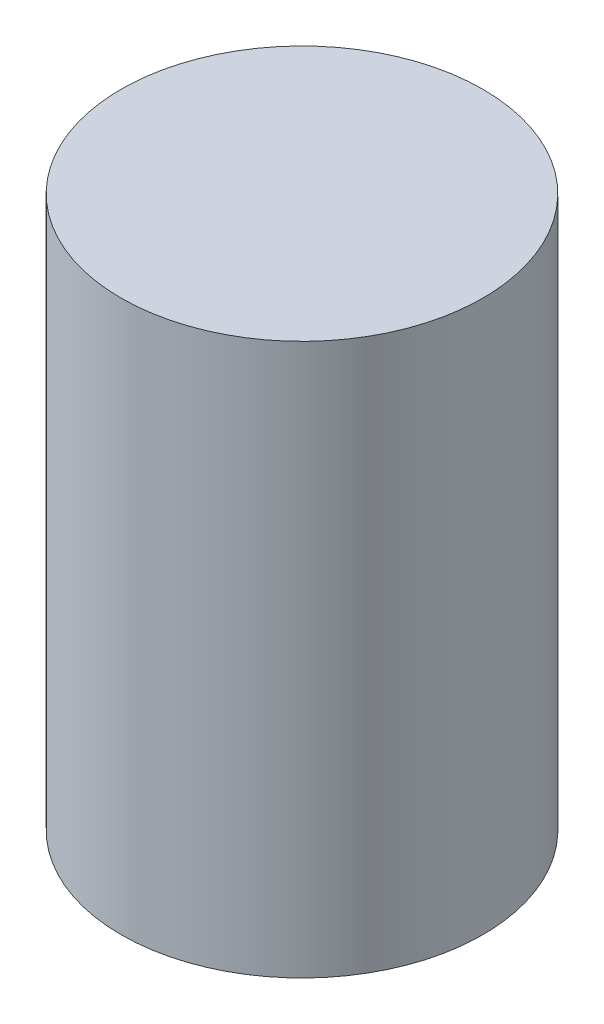
ISO-10303-21;
HEADER;
FILE_DESCRIPTION(('STEP AP214'),'2;1');
FILE_NAME('part.step','',(''),(''),'','','');
FILE_SCHEMA(('AUTOMOTIVE_DESIGN { 1 0 10303 214 1 1 1 1 }'));
ENDSEC;
DATA;
#1=APPLICATION_CONTEXT('core data for automotive mechanical design processes');
#2=APPLICATION_PROTOCOL_DEFINITION('international standard','automotive_design',2000,#1);
#3=PRODUCT_CONTEXT('',#1,'mechanical');
#4=PRODUCT('Part','Part','',(#3));
#5=PRODUCT_RELATED_PRODUCT_CATEGORY('part','',(#4));
#6=PRODUCT_DEFINITION_FORMATION('','',#4);
#7=PRODUCT_DEFINITION_CONTEXT('part definition',#1,'design');
#8=PRODUCT_DEFINITION('design','',#6,#7);
#9=PRODUCT_DEFINITION_SHAPE('','',#8);
#10=(LENGTH_UNIT() NAMED_UNIT(*) SI_UNIT(.MILLI.,.METRE.));
#11=(NAMED_UNIT(*) PLANE_ANGLE_UNIT() SI_UNIT($,.RADIAN.));
#12=(NAMED_UNIT(*) SI_UNIT($,.STERADIAN.) SOLID_ANGLE_UNIT());
#13=UNCERTAINTY_MEASURE_WITH_UNIT(LENGTH_MEASURE(1.E-05),#10,'distance_accuracy_value','');
#14=(GEOMETRIC_REPRESENTATION_CONTEXT(3) GLOBAL_UNCERTAINTY_ASSIGNED_CONTEXT((#13)) GLOBAL_UNIT_ASSIGNED_CONTEXT((#10,
#11,#12)) REPRESENTATION_CONTEXT('',''));
#15=CARTESIAN_POINT('',(0.,0.,0.));
#16=DIRECTION('',(0.,0.,1.));
#17=DIRECTION('',(1.,0.,0.));
#18=AXIS2_PLACEMENT_3D('',#15,#16,#17);
#19=CARTESIAN_POINT('',(0.,152.4,0.));
#20=DIRECTION('',(0.,-1.,0.));
#21=DIRECTION('',(0.,0.,-1.));
#22=AXIS2_PLACEMENT_3D('',#19,#20,#21);
#23=CYLINDRICAL_SURFACE('',#22,50.);
#24=CARTESIAN_POINT('',(0.,152.4,0.));
#25=DIRECTION('',(0.,1.,0.));
#26=DIRECTION('',(0.,0.,1.));
#27=AXIS2_PLACEMENT_3D('',#24,#25,#26);
#28=CIRCLE('',#27,50.);
#29=CARTESIAN_POINT('',(0.,152.4,-50.));
#30=VERTEX_POINT('',#29);
#31=EDGE_CURVE('E10',#30,#30,#28,.T.);
#32=CARTESIAN_POINT('',(0.,0.,0.));
#33=DIRECTION('',(0.,1.,0.));
#34=DIRECTION('',(0.,0.,1.));
#35=AXIS2_PLACEMENT_3D('',#32,#33,#34);
#36=CIRCLE('',#35,50.);
#37=CARTESIAN_POINT('',(0.,0.,-50.));
#38=VERTEX_POINT('',#37);
#39=EDGE_CURVE('E34',#38,#38,#36,.T.);
#40=CARTESIAN_POINT('',(0.,152.4,-50.));
#41=CARTESIAN_POINT('',(0.,150.8125,-50.));
#42=CARTESIAN_POINT('',(0.,149.225,-50.));
#43=CARTESIAN_POINT('',(0.,146.05,-50.));
#44=CARTESIAN_POINT('',(0.,144.4625,-50.));
#45=CARTESIAN_POINT('',(0.,141.2875,-50.));
#46=CARTESIAN_POINT('',(0.,139.7,-50.));
#47=CARTESIAN_POINT('',(0.,136.525,-50.));
#48=CARTESIAN_POINT('',(0.,134.9375,-50.));
#49=CARTESIAN_POINT('',(0.,131.7625,-50.));
#50=CARTESIAN_POINT('',(0.,130.175,-50.));
#51=CARTESIAN_POINT('',(0.,127.,-50.));
#52=CARTESIAN_POINT('',(0.,125.4125,-50.));
#53=CARTESIAN_POINT('',(0.,122.2375,-50.));
#54=CARTESIAN_POINT('',(0.,120.65,-50.));
#55=CARTESIAN_POINT('',(0.,117.475,-50.));
#56=CARTESIAN_POINT('',(0.,115.8875,-50.));
#57=CARTESIAN_POINT('',(0.,112.7125,-50.));
#58=CARTESIAN_POINT('',(0.,111.125,-50.));
#59=CARTESIAN_POINT('',(0.,107.95,-50.));
#60=CARTESIAN_POINT('',(0.,106.3625,-50.));
#61=CARTESIAN_POINT('',(0.,103.1875,-50.));
#62=CARTESIAN_POINT('',(0.,101.6,-50.));
#63=CARTESIAN_POINT('',(0.,98.425,-50.));
#64=CARTESIAN_POINT('',(0.,96.8375,-50.));
#65=CARTESIAN_POINT('',(0.,93.6625,-50.));
#66=CARTESIAN_POINT('',(0.,92.075,-50.));
#67=CARTESIAN_POINT('',(0.,88.9,-50.));
#68=CARTESIAN_POINT('',(0.,87.3125,-50.));
#69=CARTESIAN_POINT('',(0.,84.1375,-50.));
#70=CARTESIAN_POINT('',(0.,82.55,-50.));
#71=CARTESIAN_POINT('',(0.,79.375,-50.));
#72=CARTESIAN_POINT('',(0.,77.7875,-50.));
#73=CARTESIAN_POINT('',(0.,74.6125,-50.));
#74=CARTESIAN_POINT('',(0.,73.025,-50.));
#75=CARTESIAN_POINT('',(0.,69.85,-50.));
#76=CARTESIAN_POINT('',(0.,68.2625,-50.));
#77=CARTESIAN_POINT('',(0.,65.0875,-50.));
#78=CARTESIAN_POINT('',(0.,63.5,-50.));
#79=CARTESIAN_POINT('',(0.,60.325,-50.));
#80=CARTESIAN_POINT('',(0.,58.7375,-50.));
#81=CARTESIAN_POINT('',(0.,55.5625,-50.));
#82=CARTESIAN_POINT('',(0.,53.975,-50.));
#83=CARTESIAN_POINT('',(0.,50.8,-50.));
#84=CARTESIAN_POINT('',(0.,49.2125,-50.));
#85=CARTESIAN_POINT('',(0.,46.0375,-50.));
#86=CARTESIAN_POINT('',(0.,44.45,-50.));
#87=CARTESIAN_POINT('',(0.,41.275,-50.));
#88=CARTESIAN_POINT('',(0.,39.6875,-50.));
#89=CARTESIAN_POINT('',(0.,36.5125,-50.));
#90=CARTESIAN_POINT('',(0.,34.925,-50.));
#91=CARTESIAN_POINT('',(0.,31.75,-50.));
#92=CARTESIAN_POINT('',(0.,30.1625,-50.));
#93=CARTESIAN_POINT('',(0.,26.9875,-50.));
#94=CARTESIAN_POINT('',(0.,25.4,-50.));
#95=CARTESIAN_POINT('',(0.,22.225,-50.));
#96=CARTESIAN_POINT('',(0.,20.6375,-50.));
#97=CARTESIAN_POINT('',(0.,17.4625,-50.));
#98=CARTESIAN_POINT('',(0.,15.875,-50.));
#99=CARTESIAN_POINT('',(0.,12.7,-50.));
#100=CARTESIAN_POINT('',(0.,11.1125,-50.));
#101=CARTESIAN_POINT('',(0.,7.93750000000001,-50.));
#102=CARTESIAN_POINT('',(0.,6.35,-50.));
#103=CARTESIAN_POINT('',(0.,3.175,-50.));
#104=CARTESIAN_POINT('',(0.,1.5875,-50.));
#105=CARTESIAN_POINT('',(0.,0.,-50.));
#106=B_SPLINE_CURVE_WITH_KNOTS('',3,(#40,#41,#42,#43,#44,#45,#46,#47,#48,#49,#50,#51,#52,#53,
#54,#55,#56,#57,#58,#59,#60,#61,#62,#63,#64,#65,#66,#67,#68,#69,#70,#71,#72,#73,#74,#75,#76,#77,
#78,#79,#80,#81,#82,#83,#84,#85,#86,#87,#88,#89,#90,#91,#92,#93,#94,#95,#96,#97,#98,#99,#100,
#101,#102,#103,#104,#105),.UNSPECIFIED.,.F.,.F.,(4,2,2,2,2,2,2,2,2,2,2,2,2,2,2,2,2,2,2,2,2,2,2,
2,2,2,2,2,2,2,2,2,4),(0.,4.7625,9.52500000000001,14.2875,19.05,23.8125,28.575,33.3375,38.1,
42.8625,47.625,52.3875,57.15,61.9125,66.675,71.4375,76.2,80.9625,85.725,90.4875,95.25,100.0125,
104.775,109.5375,114.3,119.0625,123.825,128.5875,133.35,138.1125,142.875,147.6375,152.4),.UNSPECIFIED.);
#107=EDGE_CURVE('BSEAM31',#30,#38,#106,.T.);
#108=ORIENTED_EDGE('',*,*,#31,.F.);
#109=ORIENTED_EDGE('',*,*,#39,.T.);
#110=ORIENTED_EDGE('',*,*,#107,.T.);
#111=ORIENTED_EDGE('',*,*,#107,.F.);
#112=EDGE_LOOP('',(#108,#110,#109,#111));
#113=FACE_BOUND('',#112,.T.);
#114=ADVANCED_FACE('F31',(#113),#23,.T.);
#115=CARTESIAN_POINT('',(0.,152.4,0.));
#116=DIRECTION('',(0.,1.,0.));
#117=DIRECTION('',(0.,0.,1.));
#118=AXIS2_PLACEMENT_3D('',#115,#116,#117);
#119=PLANE('',#118);
#120=ORIENTED_EDGE('',*,*,#31,.T.);
#121=EDGE_LOOP('',(#120));
#122=FACE_BOUND('',#121,.T.);
#123=ADVANCED_FACE('F46',(#122),#119,.T.);
#124=CARTESIAN_POINT('',(0.,0.,0.));
#125=DIRECTION('',(0.,1.,0.));
#126=DIRECTION('',(0.,0.,1.));
#127=AXIS2_PLACEMENT_3D('',#124,#125,#126);
#128=PLANE('',#127);
#129=ORIENTED_EDGE('',*,*,#39,.F.);
#130=EDGE_LOOP('',(#129));
#131=FACE_BOUND('',#130,.T.);
#132=ADVANCED_FACE('F44',(#131),#128,.F.);
#133=CLOSED_SHELL('',(#114,#123,#132));
#134=MANIFOLD_SOLID_BREP('B2',#133);
#135=ADVANCED_BREP_SHAPE_REPRESENTATION('',(#18,#134),#14);
#136=SHAPE_DEFINITION_REPRESENTATION(#9,#135);
ENDSEC;
END-ISO-10303-21;
